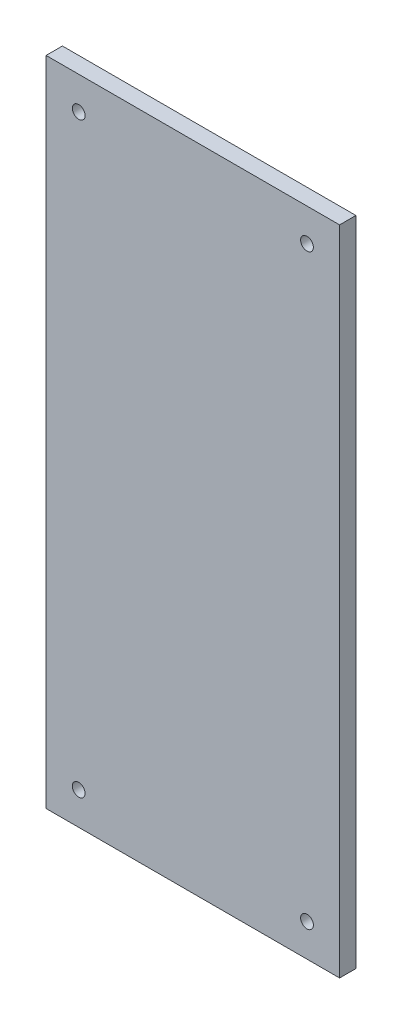
ISO-10303-21;
HEADER;
FILE_DESCRIPTION(('STEP AP214'),'2;1');
FILE_NAME('part.step','',(''),(''),'','','');
FILE_SCHEMA(('AUTOMOTIVE_DESIGN { 1 0 10303 214 1 1 1 1 }'));
ENDSEC;
DATA;
#1=APPLICATION_CONTEXT('core data for automotive mechanical design processes');
#2=APPLICATION_PROTOCOL_DEFINITION('international standard','automotive_design',2000,#1);
#3=PRODUCT_CONTEXT('',#1,'mechanical');
#4=PRODUCT('Part','Part','',(#3));
#5=PRODUCT_RELATED_PRODUCT_CATEGORY('part','',(#4));
#6=PRODUCT_DEFINITION_FORMATION('','',#4);
#7=PRODUCT_DEFINITION_CONTEXT('part definition',#1,'design');
#8=PRODUCT_DEFINITION('design','',#6,#7);
#9=PRODUCT_DEFINITION_SHAPE('','',#8);
#10=(LENGTH_UNIT() NAMED_UNIT(*) SI_UNIT(.MILLI.,.METRE.));
#11=(NAMED_UNIT(*) PLANE_ANGLE_UNIT() SI_UNIT($,.RADIAN.));
#12=(NAMED_UNIT(*) SI_UNIT($,.STERADIAN.) SOLID_ANGLE_UNIT());
#13=UNCERTAINTY_MEASURE_WITH_UNIT(LENGTH_MEASURE(1.E-05),#10,'distance_accuracy_value','');
#14=(GEOMETRIC_REPRESENTATION_CONTEXT(3) GLOBAL_UNCERTAINTY_ASSIGNED_CONTEXT((#13)) GLOBAL_UNIT_ASSIGNED_CONTEXT((#10,
#11,#12)) REPRESENTATION_CONTEXT('',''));
#15=CARTESIAN_POINT('',(0.,0.,0.));
#16=DIRECTION('',(0.,0.,1.));
#17=DIRECTION('',(1.,0.,0.));
#18=AXIS2_PLACEMENT_3D('',#15,#16,#17);
#19=CARTESIAN_POINT('',(0.,0.,3.175));
#20=DIRECTION('',(1.,0.,0.));
#21=DIRECTION('',(0.,0.,-1.));
#22=AXIS2_PLACEMENT_3D('',#19,#20,#21);
#23=PLANE('',#22);
#24=DIRECTION('',(0.,-1.,0.));
#25=VECTOR('',#24,1.);
#26=CARTESIAN_POINT('',(0.,0.,-3.175));
#27=LINE('',#26,#25);
#28=CARTESIAN_POINT('',(0.,254.,-3.175));
#29=VERTEX_POINT('',#28);
#30=CARTESIAN_POINT('',(0.,0.,-3.175));
#31=VERTEX_POINT('',#30);
#32=EDGE_CURVE('E100',#29,#31,#27,.T.);
#33=ORIENTED_EDGE('',*,*,#32,.T.);
#34=DIRECTION('',(0.,0.,-1.));
#35=VECTOR('',#34,1.);
#36=CARTESIAN_POINT('',(0.,0.,3.175));
#37=LINE('',#36,#35);
#38=CARTESIAN_POINT('',(0.,0.,3.175));
#39=VERTEX_POINT('',#38);
#40=EDGE_CURVE('E11',#39,#31,#37,.T.);
#41=ORIENTED_EDGE('',*,*,#40,.F.);
#42=DIRECTION('',(0.,-1.,0.));
#43=VECTOR('',#42,1.);
#44=CARTESIAN_POINT('',(0.,0.,3.175));
#45=LINE('',#44,#43);
#46=CARTESIAN_POINT('',(0.,254.,3.175));
#47=VERTEX_POINT('',#46);
#48=EDGE_CURVE('E88',#47,#39,#45,.T.);
#49=ORIENTED_EDGE('',*,*,#48,.F.);
#50=DIRECTION('',(0.,0.,-1.));
#51=VECTOR('',#50,1.);
#52=CARTESIAN_POINT('',(0.,254.,3.175));
#53=LINE('',#52,#51);
#54=EDGE_CURVE('E96',#47,#29,#53,.T.);
#55=ORIENTED_EDGE('',*,*,#54,.T.);
#56=EDGE_LOOP('',(#33,#41,#49,#55));
#57=FACE_BOUND('',#56,.T.);
#58=ADVANCED_FACE('F37',(#57),#23,.F.);
#59=CARTESIAN_POINT('',(0.,0.,3.175));
#60=DIRECTION('',(0.,1.,0.));
#61=DIRECTION('',(0.,0.,1.));
#62=AXIS2_PLACEMENT_3D('',#59,#60,#61);
#63=PLANE('',#62);
#64=DIRECTION('',(1.,0.,0.));
#65=VECTOR('',#64,1.);
#66=CARTESIAN_POINT('',(0.,0.,-3.175));
#67=LINE('',#66,#65);
#68=CARTESIAN_POINT('',(114.3,0.,-3.175));
#69=VERTEX_POINT('',#68);
#70=EDGE_CURVE('E92',#31,#69,#67,.T.);
#71=ORIENTED_EDGE('',*,*,#70,.T.);
#72=DIRECTION('',(0.,0.,-1.));
#73=VECTOR('',#72,1.);
#74=CARTESIAN_POINT('',(114.3,0.,3.175));
#75=LINE('',#74,#73);
#76=CARTESIAN_POINT('',(114.3,0.,3.175));
#77=VERTEX_POINT('',#76);
#78=EDGE_CURVE('E45',#77,#69,#75,.T.);
#79=ORIENTED_EDGE('',*,*,#78,.F.);
#80=DIRECTION('',(1.,0.,0.));
#81=VECTOR('',#80,1.);
#82=CARTESIAN_POINT('',(0.,0.,3.175));
#83=LINE('',#82,#81);
#84=EDGE_CURVE('E83',#39,#77,#83,.T.);
#85=ORIENTED_EDGE('',*,*,#84,.F.);
#86=ORIENTED_EDGE('',*,*,#40,.T.);
#87=EDGE_LOOP('',(#71,#79,#85,#86));
#88=FACE_BOUND('',#87,.T.);
#89=ADVANCED_FACE('F91',(#88),#63,.F.);
#90=CARTESIAN_POINT('',(114.3,0.,3.175));
#91=DIRECTION('',(-1.,0.,0.));
#92=DIRECTION('',(0.,0.,1.));
#93=AXIS2_PLACEMENT_3D('',#90,#91,#92);
#94=PLANE('',#93);
#95=DIRECTION('',(0.,1.,0.));
#96=VECTOR('',#95,1.);
#97=CARTESIAN_POINT('',(114.3,0.,-3.175));
#98=LINE('',#97,#96);
#99=CARTESIAN_POINT('',(114.3,254.,-3.175));
#100=VERTEX_POINT('',#99);
#101=EDGE_CURVE('E70',#69,#100,#98,.T.);
#102=ORIENTED_EDGE('',*,*,#101,.T.);
#103=DIRECTION('',(0.,0.,-1.));
#104=VECTOR('',#103,1.);
#105=CARTESIAN_POINT('',(114.3,254.,3.175));
#106=LINE('',#105,#104);
#107=CARTESIAN_POINT('',(114.3,254.,3.175));
#108=VERTEX_POINT('',#107);
#109=EDGE_CURVE('E93',#108,#100,#106,.T.);
#110=ORIENTED_EDGE('',*,*,#109,.F.);
#111=DIRECTION('',(0.,1.,0.));
#112=VECTOR('',#111,1.);
#113=CARTESIAN_POINT('',(114.3,0.,3.175));
#114=LINE('',#113,#112);
#115=EDGE_CURVE('E86',#77,#108,#114,.T.);
#116=ORIENTED_EDGE('',*,*,#115,.F.);
#117=ORIENTED_EDGE('',*,*,#78,.T.);
#118=EDGE_LOOP('',(#102,#110,#116,#117));
#119=FACE_BOUND('',#118,.T.);
#120=ADVANCED_FACE('F94',(#119),#94,.F.);
#121=CARTESIAN_POINT('',(0.,254.,3.175));
#122=DIRECTION('',(0.,-1.,0.));
#123=DIRECTION('',(0.,0.,-1.));
#124=AXIS2_PLACEMENT_3D('',#121,#122,#123);
#125=PLANE('',#124);
#126=DIRECTION('',(-1.,0.,0.));
#127=VECTOR('',#126,1.);
#128=CARTESIAN_POINT('',(0.,254.,-3.175));
#129=LINE('',#128,#127);
#130=EDGE_CURVE('E76',#100,#29,#129,.T.);
#131=ORIENTED_EDGE('',*,*,#130,.T.);
#132=ORIENTED_EDGE('',*,*,#54,.F.);
#133=DIRECTION('',(-1.,0.,0.));
#134=VECTOR('',#133,1.);
#135=CARTESIAN_POINT('',(0.,254.,3.175));
#136=LINE('',#135,#134);
#137=EDGE_CURVE('E53',#108,#47,#136,.T.);
#138=ORIENTED_EDGE('',*,*,#137,.F.);
#139=ORIENTED_EDGE('',*,*,#109,.T.);
#140=EDGE_LOOP('',(#131,#132,#138,#139));
#141=FACE_BOUND('',#140,.T.);
#142=ADVANCED_FACE('F108',(#141),#125,.F.);
#143=CARTESIAN_POINT('',(0.,0.,3.175));
#144=DIRECTION('',(0.,0.,-1.));
#145=DIRECTION('',(-1.,0.,0.));
#146=AXIS2_PLACEMENT_3D('',#143,#144,#145);
#147=PLANE('',#146);
#148=CARTESIAN_POINT('',(12.7,12.7,3.175));
#149=DIRECTION('',(0.,0.,1.));
#150=DIRECTION('',(1.,0.,0.));
#151=AXIS2_PLACEMENT_3D('',#148,#149,#150);
#152=CIRCLE('',#151,2.4892);
#153=CARTESIAN_POINT('',(15.1892,12.7,3.175));
#154=VERTEX_POINT('',#153);
#155=EDGE_CURVE('E127',#154,#154,#152,.T.);
#156=ORIENTED_EDGE('',*,*,#155,.F.);
#157=EDGE_LOOP('',(#156));
#158=FACE_BOUND('',#157,.T.);
#159=CARTESIAN_POINT('',(101.6,241.3,3.175));
#160=DIRECTION('',(0.,0.,1.));
#161=DIRECTION('',(1.,0.,0.));
#162=AXIS2_PLACEMENT_3D('',#159,#160,#161);
#163=CIRCLE('',#162,2.48920000000001);
#164=CARTESIAN_POINT('',(104.0892,241.3,3.175));
#165=VERTEX_POINT('',#164);
#166=EDGE_CURVE('E120',#165,#165,#163,.T.);
#167=ORIENTED_EDGE('',*,*,#166,.F.);
#168=EDGE_LOOP('',(#167));
#169=FACE_BOUND('',#168,.T.);
#170=CARTESIAN_POINT('',(101.6,12.7,3.175));
#171=DIRECTION('',(0.,0.,1.));
#172=DIRECTION('',(1.,0.,0.));
#173=AXIS2_PLACEMENT_3D('',#170,#171,#172);
#174=CIRCLE('',#173,2.4892);
#175=CARTESIAN_POINT('',(104.0892,12.7,3.175));
#176=VERTEX_POINT('',#175);
#177=EDGE_CURVE('E132',#176,#176,#174,.T.);
#178=ORIENTED_EDGE('',*,*,#177,.F.);
#179=EDGE_LOOP('',(#178));
#180=FACE_BOUND('',#179,.T.);
#181=CARTESIAN_POINT('',(12.7,241.3,3.175));
#182=DIRECTION('',(0.,0.,1.));
#183=DIRECTION('',(1.,0.,0.));
#184=AXIS2_PLACEMENT_3D('',#181,#182,#183);
#185=CIRCLE('',#184,2.4892);
#186=CARTESIAN_POINT('',(15.1892,241.3,3.175));
#187=VERTEX_POINT('',#186);
#188=EDGE_CURVE('E114',#187,#187,#185,.T.);
#189=ORIENTED_EDGE('',*,*,#188,.F.);
#190=EDGE_LOOP('',(#189));
#191=FACE_BOUND('',#190,.T.);
#192=ORIENTED_EDGE('',*,*,#48,.T.);
#193=ORIENTED_EDGE('',*,*,#84,.T.);
#194=ORIENTED_EDGE('',*,*,#115,.T.);
#195=ORIENTED_EDGE('',*,*,#137,.T.);
#196=EDGE_LOOP('',(#192,#193,#194,#195));
#197=FACE_BOUND('',#196,.T.);
#198=ADVANCED_FACE('F84',(#158,#169,#180,#191,#197),#147,.F.);
#199=CARTESIAN_POINT('',(0.,0.,-3.175));
#200=DIRECTION('',(0.,0.,-1.));
#201=DIRECTION('',(-1.,0.,0.));
#202=AXIS2_PLACEMENT_3D('',#199,#200,#201);
#203=PLANE('',#202);
#204=CARTESIAN_POINT('',(12.7,12.7,-3.175));
#205=DIRECTION('',(0.,0.,1.));
#206=DIRECTION('',(1.,0.,0.));
#207=AXIS2_PLACEMENT_3D('',#204,#205,#206);
#208=CIRCLE('',#207,2.4892);
#209=CARTESIAN_POINT('',(15.1892,12.7,-3.175));
#210=VERTEX_POINT('',#209);
#211=EDGE_CURVE('E117',#210,#210,#208,.T.);
#212=ORIENTED_EDGE('',*,*,#211,.T.);
#213=EDGE_LOOP('',(#212));
#214=FACE_BOUND('',#213,.T.);
#215=CARTESIAN_POINT('',(101.6,241.3,-3.175));
#216=DIRECTION('',(0.,0.,1.));
#217=DIRECTION('',(1.,0.,0.));
#218=AXIS2_PLACEMENT_3D('',#215,#216,#217);
#219=CIRCLE('',#218,2.48920000000001);
#220=CARTESIAN_POINT('',(104.0892,241.3,-3.175));
#221=VERTEX_POINT('',#220);
#222=EDGE_CURVE('E123',#221,#221,#219,.T.);
#223=ORIENTED_EDGE('',*,*,#222,.T.);
#224=EDGE_LOOP('',(#223));
#225=FACE_BOUND('',#224,.T.);
#226=CARTESIAN_POINT('',(101.6,12.7,-3.175));
#227=DIRECTION('',(0.,0.,1.));
#228=DIRECTION('',(1.,0.,0.));
#229=AXIS2_PLACEMENT_3D('',#226,#227,#228);
#230=CIRCLE('',#229,2.4892);
#231=CARTESIAN_POINT('',(104.0892,12.7,-3.175));
#232=VERTEX_POINT('',#231);
#233=EDGE_CURVE('E124',#232,#232,#230,.T.);
#234=ORIENTED_EDGE('',*,*,#233,.T.);
#235=EDGE_LOOP('',(#234));
#236=FACE_BOUND('',#235,.T.);
#237=CARTESIAN_POINT('',(12.7,241.3,-3.175));
#238=DIRECTION('',(0.,0.,1.));
#239=DIRECTION('',(1.,0.,0.));
#240=AXIS2_PLACEMENT_3D('',#237,#238,#239);
#241=CIRCLE('',#240,2.4892);
#242=CARTESIAN_POINT('',(15.1892,241.3,-3.175));
#243=VERTEX_POINT('',#242);
#244=EDGE_CURVE('E103',#243,#243,#241,.T.);
#245=ORIENTED_EDGE('',*,*,#244,.T.);
#246=EDGE_LOOP('',(#245));
#247=FACE_BOUND('',#246,.T.);
#248=ORIENTED_EDGE('',*,*,#32,.F.);
#249=ORIENTED_EDGE('',*,*,#130,.F.);
#250=ORIENTED_EDGE('',*,*,#101,.F.);
#251=ORIENTED_EDGE('',*,*,#70,.F.);
#252=EDGE_LOOP('',(#248,#249,#250,#251));
#253=FACE_BOUND('',#252,.T.);
#254=ADVANCED_FACE('F111',(#214,#225,#236,#247,#253),#203,.T.);
#255=CARTESIAN_POINT('',(12.7,241.3,-3.175));
#256=DIRECTION('',(0.,0.,1.));
#257=DIRECTION('',(1.,0.,0.));
#258=AXIS2_PLACEMENT_3D('',#255,#256,#257);
#259=CYLINDRICAL_SURFACE('',#258,2.4892);
#260=ORIENTED_EDGE('',*,*,#244,.F.);
#261=EDGE_LOOP('',(#260));
#262=FACE_BOUND('',#261,.T.);
#263=ORIENTED_EDGE('',*,*,#188,.T.);
#264=EDGE_LOOP('',(#263));
#265=FACE_BOUND('',#264,.T.);
#266=ADVANCED_FACE('F144',(#262,#265),#259,.F.);
#267=CARTESIAN_POINT('',(101.6,12.7,-3.175));
#268=DIRECTION('',(0.,0.,1.));
#269=DIRECTION('',(1.,0.,0.));
#270=AXIS2_PLACEMENT_3D('',#267,#268,#269);
#271=CYLINDRICAL_SURFACE('',#270,2.4892);
#272=ORIENTED_EDGE('',*,*,#233,.F.);
#273=EDGE_LOOP('',(#272));
#274=FACE_BOUND('',#273,.T.);
#275=ORIENTED_EDGE('',*,*,#177,.T.);
#276=EDGE_LOOP('',(#275));
#277=FACE_BOUND('',#276,.T.);
#278=ADVANCED_FACE('F140',(#274,#277),#271,.F.);
#279=CARTESIAN_POINT('',(101.6,241.3,-3.175));
#280=DIRECTION('',(0.,0.,1.));
#281=DIRECTION('',(1.,0.,0.));
#282=AXIS2_PLACEMENT_3D('',#279,#280,#281);
#283=CYLINDRICAL_SURFACE('',#282,2.48920000000001);
#284=ORIENTED_EDGE('',*,*,#222,.F.);
#285=EDGE_LOOP('',(#284));
#286=FACE_BOUND('',#285,.T.);
#287=ORIENTED_EDGE('',*,*,#166,.T.);
#288=EDGE_LOOP('',(#287));
#289=FACE_BOUND('',#288,.T.);
#290=ADVANCED_FACE('F143',(#286,#289),#283,.F.);
#291=CARTESIAN_POINT('',(12.7,12.7,-3.175));
#292=DIRECTION('',(0.,0.,1.));
#293=DIRECTION('',(1.,0.,0.));
#294=AXIS2_PLACEMENT_3D('',#291,#292,#293);
#295=CYLINDRICAL_SURFACE('',#294,2.4892);
#296=ORIENTED_EDGE('',*,*,#211,.F.);
#297=EDGE_LOOP('',(#296));
#298=FACE_BOUND('',#297,.T.);
#299=ORIENTED_EDGE('',*,*,#155,.T.);
#300=EDGE_LOOP('',(#299));
#301=FACE_BOUND('',#300,.T.);
#302=ADVANCED_FACE('F205',(#298,#301),#295,.F.);
#303=CLOSED_SHELL('',(#58,#89,#120,#142,#198,#254,#266,#278,#290,#302));
#304=MANIFOLD_SOLID_BREP('B2',#303);
#305=ADVANCED_BREP_SHAPE_REPRESENTATION('',(#18,#304),#14);
#306=SHAPE_DEFINITION_REPRESENTATION(#9,#305);
ENDSEC;
END-ISO-10303-21;
